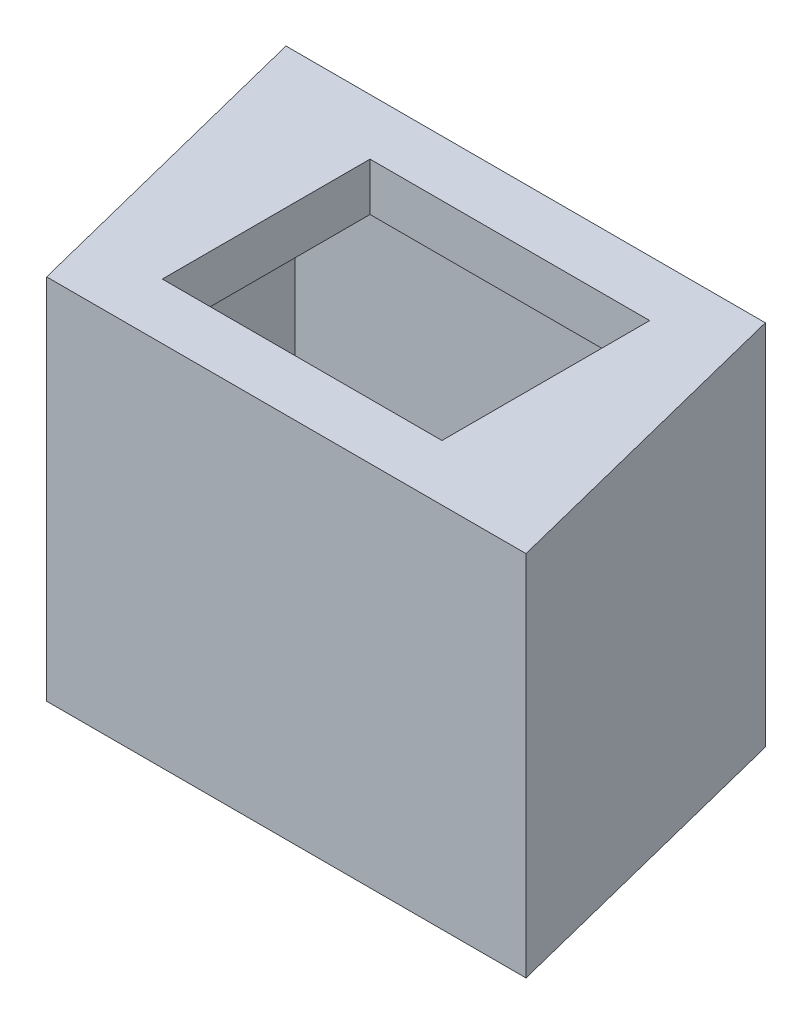
ISO-10303-21;
HEADER;
FILE_DESCRIPTION(('STEP AP214'),'2;1');
FILE_NAME('part.step','',(''),(''),'','','');
FILE_SCHEMA(('AUTOMOTIVE_DESIGN { 1 0 10303 214 1 1 1 1 }'));
ENDSEC;
DATA;
#1=APPLICATION_CONTEXT('core data for automotive mechanical design processes');
#2=APPLICATION_PROTOCOL_DEFINITION('international standard','automotive_design',2000,#1);
#3=PRODUCT_CONTEXT('',#1,'mechanical');
#4=PRODUCT('Part','Part','',(#3));
#5=PRODUCT_RELATED_PRODUCT_CATEGORY('part','',(#4));
#6=PRODUCT_DEFINITION_FORMATION('','',#4);
#7=PRODUCT_DEFINITION_CONTEXT('part definition',#1,'design');
#8=PRODUCT_DEFINITION('design','',#6,#7);
#9=PRODUCT_DEFINITION_SHAPE('','',#8);
#10=(LENGTH_UNIT() NAMED_UNIT(*) SI_UNIT(.MILLI.,.METRE.));
#11=(NAMED_UNIT(*) PLANE_ANGLE_UNIT() SI_UNIT($,.RADIAN.));
#12=(NAMED_UNIT(*) SI_UNIT($,.STERADIAN.) SOLID_ANGLE_UNIT());
#13=UNCERTAINTY_MEASURE_WITH_UNIT(LENGTH_MEASURE(1.E-05),#10,'distance_accuracy_value','');
#14=(GEOMETRIC_REPRESENTATION_CONTEXT(3) GLOBAL_UNCERTAINTY_ASSIGNED_CONTEXT((#13)) GLOBAL_UNIT_ASSIGNED_CONTEXT((#10,
#11,#12)) REPRESENTATION_CONTEXT('',''));
#15=CARTESIAN_POINT('',(0.,0.,0.));
#16=DIRECTION('',(0.,0.,1.));
#17=DIRECTION('',(1.,0.,0.));
#18=AXIS2_PLACEMENT_3D('',#15,#16,#17);
#19=CARTESIAN_POINT('',(5.02365276957694,3.,20.));
#20=DIRECTION('',(0.969872015284747,0.,-0.243615011786019));
#21=DIRECTION('',(-0.24361501178602,0.,-0.969872015284748));
#22=AXIS2_PLACEMENT_3D('',#19,#20,#21);
#23=PLANE('',#22);
#24=DIRECTION('',(0.,-1.,0.));
#25=VECTOR('',#24,1.);
#26=CARTESIAN_POINT('',(0.,3.,0.));
#27=LINE('',#26,#25);
#28=CARTESIAN_POINT('',(0.,3.,0.));
#29=VERTEX_POINT('',#28);
#30=CARTESIAN_POINT('',(0.,-20.,0.));
#31=VERTEX_POINT('',#30);
#32=EDGE_CURVE('E210',#29,#31,#27,.T.);
#33=ORIENTED_EDGE('',*,*,#32,.T.);
#34=DIRECTION('',(-0.243615011786019,0.,-0.969872015284748));
#35=VECTOR('',#34,1.);
#36=CARTESIAN_POINT('',(5.02365276957694,-20.,20.));
#37=LINE('',#36,#35);
#38=CARTESIAN_POINT('',(5.02365276957694,-20.,20.));
#39=VERTEX_POINT('',#38);
#40=EDGE_CURVE('E160',#39,#31,#37,.T.);
#41=ORIENTED_EDGE('',*,*,#40,.F.);
#42=DIRECTION('',(0.,-1.,0.));
#43=VECTOR('',#42,1.);
#44=CARTESIAN_POINT('',(5.02365276957694,3.,20.));
#45=LINE('',#44,#43);
#46=CARTESIAN_POINT('',(5.02365276957694,3.,20.));
#47=VERTEX_POINT('',#46);
#48=EDGE_CURVE('E11',#47,#39,#45,.T.);
#49=ORIENTED_EDGE('',*,*,#48,.F.);
#50=DIRECTION('',(0.243615011786019,0.,0.969872015284748));
#51=VECTOR('',#50,1.);
#52=CARTESIAN_POINT('',(5.02365276957694,3.,20.));
#53=LINE('',#52,#51);
#54=EDGE_CURVE('E195',#29,#47,#53,.T.);
#55=ORIENTED_EDGE('',*,*,#54,.F.);
#56=EDGE_LOOP('',(#33,#41,#49,#55));
#57=FACE_BOUND('',#56,.T.);
#58=ADVANCED_FACE('F35',(#57),#23,.F.);
#59=CARTESIAN_POINT('',(35.0236527695769,3.,20.));
#60=DIRECTION('',(0.,0.,-1.));
#61=DIRECTION('',(-1.,0.,0.));
#62=AXIS2_PLACEMENT_3D('',#59,#60,#61);
#63=PLANE('',#62);
#64=ORIENTED_EDGE('',*,*,#48,.T.);
#65=DIRECTION('',(-1.,0.,0.));
#66=VECTOR('',#65,1.);
#67=CARTESIAN_POINT('',(35.0236527695769,-20.,20.));
#68=LINE('',#67,#66);
#69=CARTESIAN_POINT('',(35.0236527695769,-20.,20.));
#70=VERTEX_POINT('',#69);
#71=EDGE_CURVE('E136',#70,#39,#68,.T.);
#72=ORIENTED_EDGE('',*,*,#71,.F.);
#73=DIRECTION('',(0.,-1.,0.));
#74=VECTOR('',#73,1.);
#75=CARTESIAN_POINT('',(35.0236527695769,3.,20.));
#76=LINE('',#75,#74);
#77=CARTESIAN_POINT('',(35.0236527695769,3.,20.));
#78=VERTEX_POINT('',#77);
#79=EDGE_CURVE('E42',#78,#70,#76,.T.);
#80=ORIENTED_EDGE('',*,*,#79,.F.);
#81=DIRECTION('',(1.,0.,0.));
#82=VECTOR('',#81,1.);
#83=CARTESIAN_POINT('',(35.0236527695769,3.,20.));
#84=LINE('',#83,#82);
#85=EDGE_CURVE('E204',#47,#78,#84,.T.);
#86=ORIENTED_EDGE('',*,*,#85,.F.);
#87=EDGE_LOOP('',(#64,#72,#80,#86));
#88=FACE_BOUND('',#87,.T.);
#89=ADVANCED_FACE('F223',(#88),#63,.F.);
#90=CARTESIAN_POINT('',(30.,3.,0.));
#91=DIRECTION('',(-0.969872015284747,0.,0.24361501178602));
#92=DIRECTION('',(0.24361501178602,0.,0.969872015284748));
#93=AXIS2_PLACEMENT_3D('',#90,#91,#92);
#94=PLANE('',#93);
#95=ORIENTED_EDGE('',*,*,#79,.T.);
#96=DIRECTION('',(0.24361501178602,0.,0.969872015284748));
#97=VECTOR('',#96,1.);
#98=CARTESIAN_POINT('',(30.,-20.,0.));
#99=LINE('',#98,#97);
#100=CARTESIAN_POINT('',(30.,-20.,0.));
#101=VERTEX_POINT('',#100);
#102=EDGE_CURVE('E166',#101,#70,#99,.T.);
#103=ORIENTED_EDGE('',*,*,#102,.F.);
#104=DIRECTION('',(0.,-1.,0.));
#105=VECTOR('',#104,1.);
#106=CARTESIAN_POINT('',(30.,3.,0.));
#107=LINE('',#106,#105);
#108=CARTESIAN_POINT('',(30.,3.,0.));
#109=VERTEX_POINT('',#108);
#110=EDGE_CURVE('E212',#109,#101,#107,.T.);
#111=ORIENTED_EDGE('',*,*,#110,.F.);
#112=DIRECTION('',(-0.24361501178602,0.,-0.969872015284748));
#113=VECTOR('',#112,1.);
#114=CARTESIAN_POINT('',(30.,3.,0.));
#115=LINE('',#114,#113);
#116=EDGE_CURVE('E206',#78,#109,#115,.T.);
#117=ORIENTED_EDGE('',*,*,#116,.F.);
#118=EDGE_LOOP('',(#95,#103,#111,#117));
#119=FACE_BOUND('',#118,.T.);
#120=ADVANCED_FACE('F217',(#119),#94,.F.);
#121=CARTESIAN_POINT('',(0.,3.,0.));
#122=DIRECTION('',(0.,0.,1.));
#123=DIRECTION('',(1.,0.,0.));
#124=AXIS2_PLACEMENT_3D('',#121,#122,#123);
#125=PLANE('',#124);
#126=ORIENTED_EDGE('',*,*,#110,.T.);
#127=DIRECTION('',(1.,0.,0.));
#128=VECTOR('',#127,1.);
#129=CARTESIAN_POINT('',(0.,-20.,0.));
#130=LINE('',#129,#128);
#131=EDGE_CURVE('E163',#31,#101,#130,.T.);
#132=ORIENTED_EDGE('',*,*,#131,.F.);
#133=ORIENTED_EDGE('',*,*,#32,.F.);
#134=DIRECTION('',(-1.,0.,0.));
#135=VECTOR('',#134,1.);
#136=CARTESIAN_POINT('',(0.,3.,0.));
#137=LINE('',#136,#135);
#138=EDGE_CURVE('E208',#109,#29,#137,.T.);
#139=ORIENTED_EDGE('',*,*,#138,.F.);
#140=EDGE_LOOP('',(#126,#132,#133,#139));
#141=FACE_BOUND('',#140,.T.);
#142=ADVANCED_FACE('F230',(#141),#125,.F.);
#143=CARTESIAN_POINT('',(0.,3.,0.));
#144=DIRECTION('',(0.,-1.,0.));
#145=DIRECTION('',(0.,0.,-1.));
#146=AXIS2_PLACEMENT_3D('',#143,#144,#145);
#147=PLANE('',#146);
#148=DIRECTION('',(1.,0.,0.));
#149=VECTOR('',#148,1.);
#150=CARTESIAN_POINT('',(8.76182638478847,3.,16.5));
#151=LINE('',#150,#149);
#152=CARTESIAN_POINT('',(8.76182638478847,3.,16.5));
#153=VERTEX_POINT('',#152);
#154=CARTESIAN_POINT('',(26.2618263847885,3.,16.5));
#155=VERTEX_POINT('',#154);
#156=EDGE_CURVE('E185',#153,#155,#151,.T.);
#157=ORIENTED_EDGE('',*,*,#156,.F.);
#158=DIRECTION('',(0.,0.,1.));
#159=VECTOR('',#158,1.);
#160=CARTESIAN_POINT('',(8.76182638478847,3.,3.5));
#161=LINE('',#160,#159);
#162=CARTESIAN_POINT('',(8.76182638478847,3.,3.5));
#163=VERTEX_POINT('',#162);
#164=EDGE_CURVE('E169',#163,#153,#161,.T.);
#165=ORIENTED_EDGE('',*,*,#164,.F.);
#166=DIRECTION('',(-1.,0.,0.));
#167=VECTOR('',#166,1.);
#168=CARTESIAN_POINT('',(8.76182638478847,3.,3.5));
#169=LINE('',#168,#167);
#170=CARTESIAN_POINT('',(26.2618263847885,3.,3.5));
#171=VERTEX_POINT('',#170);
#172=EDGE_CURVE('E174',#171,#163,#169,.T.);
#173=ORIENTED_EDGE('',*,*,#172,.F.);
#174=DIRECTION('',(0.,0.,-1.));
#175=VECTOR('',#174,1.);
#176=CARTESIAN_POINT('',(26.2618263847885,3.,3.5));
#177=LINE('',#176,#175);
#178=EDGE_CURVE('E188',#155,#171,#177,.T.);
#179=ORIENTED_EDGE('',*,*,#178,.F.);
#180=EDGE_LOOP('',(#157,#165,#173,#179));
#181=FACE_BOUND('',#180,.T.);
#182=ORIENTED_EDGE('',*,*,#54,.T.);
#183=ORIENTED_EDGE('',*,*,#85,.T.);
#184=ORIENTED_EDGE('',*,*,#116,.T.);
#185=ORIENTED_EDGE('',*,*,#138,.T.);
#186=EDGE_LOOP('',(#182,#183,#184,#185));
#187=FACE_BOUND('',#186,.T.);
#188=ADVANCED_FACE('F233',(#181,#187),#147,.F.);
#189=CARTESIAN_POINT('',(0.,0.,0.));
#190=DIRECTION('',(0.,-1.,0.));
#191=DIRECTION('',(0.,0.,-1.));
#192=AXIS2_PLACEMENT_3D('',#189,#190,#191);
#193=PLANE('',#192);
#194=DIRECTION('',(-1.,0.,0.));
#195=VECTOR('',#194,1.);
#196=CARTESIAN_POINT('',(32.4591597391828,0.,18.));
#197=LINE('',#196,#195);
#198=CARTESIAN_POINT('',(32.4591597391828,0.,18.));
#199=VERTEX_POINT('',#198);
#200=CARTESIAN_POINT('',(6.58341524605567,0.,18.));
#201=VERTEX_POINT('',#200);
#202=EDGE_CURVE('E49',#199,#201,#197,.T.);
#203=ORIENTED_EDGE('',*,*,#202,.T.);
#204=DIRECTION('',(-0.243615011786019,0.,-0.969872015284748));
#205=VECTOR('',#204,1.);
#206=CARTESIAN_POINT('',(6.58341524605567,0.,18.));
#207=LINE('',#206,#205);
#208=CARTESIAN_POINT('',(2.56449303039413,0.,2.));
#209=VERTEX_POINT('',#208);
#210=EDGE_CURVE('E53',#201,#209,#207,.T.);
#211=ORIENTED_EDGE('',*,*,#210,.T.);
#212=DIRECTION('',(1.,0.,0.));
#213=VECTOR('',#212,1.);
#214=CARTESIAN_POINT('',(2.56449303039413,0.,2.));
#215=LINE('',#214,#213);
#216=CARTESIAN_POINT('',(28.4402375235213,0.,2.));
#217=VERTEX_POINT('',#216);
#218=EDGE_CURVE('E150',#209,#217,#215,.T.);
#219=ORIENTED_EDGE('',*,*,#218,.T.);
#220=DIRECTION('',(0.243615011786019,0.,0.969872015284748));
#221=VECTOR('',#220,1.);
#222=CARTESIAN_POINT('',(28.4402375235213,0.,2.));
#223=LINE('',#222,#221);
#224=EDGE_CURVE('E131',#217,#199,#223,.T.);
#225=ORIENTED_EDGE('',*,*,#224,.T.);
#226=EDGE_LOOP('',(#203,#211,#219,#225));
#227=FACE_BOUND('',#226,.T.);
#228=DIRECTION('',(0.,0.,1.));
#229=VECTOR('',#228,1.);
#230=CARTESIAN_POINT('',(8.76182638478847,0.,3.5));
#231=LINE('',#230,#229);
#232=CARTESIAN_POINT('',(8.76182638478847,0.,3.5));
#233=VERTEX_POINT('',#232);
#234=CARTESIAN_POINT('',(8.76182638478847,0.,16.5));
#235=VERTEX_POINT('',#234);
#236=EDGE_CURVE('E170',#233,#235,#231,.T.);
#237=ORIENTED_EDGE('',*,*,#236,.T.);
#238=DIRECTION('',(1.,0.,0.));
#239=VECTOR('',#238,1.);
#240=CARTESIAN_POINT('',(8.76182638478847,0.,16.5));
#241=LINE('',#240,#239);
#242=CARTESIAN_POINT('',(26.2618263847885,0.,16.5));
#243=VERTEX_POINT('',#242);
#244=EDGE_CURVE('E173',#235,#243,#241,.T.);
#245=ORIENTED_EDGE('',*,*,#244,.T.);
#246=DIRECTION('',(0.,0.,-1.));
#247=VECTOR('',#246,1.);
#248=CARTESIAN_POINT('',(26.2618263847885,0.,3.5));
#249=LINE('',#248,#247);
#250=CARTESIAN_POINT('',(26.2618263847885,0.,3.5));
#251=VERTEX_POINT('',#250);
#252=EDGE_CURVE('E177',#243,#251,#249,.T.);
#253=ORIENTED_EDGE('',*,*,#252,.T.);
#254=DIRECTION('',(-1.,0.,0.));
#255=VECTOR('',#254,1.);
#256=CARTESIAN_POINT('',(8.76182638478847,0.,3.5));
#257=LINE('',#256,#255);
#258=EDGE_CURVE('E180',#251,#233,#257,.T.);
#259=ORIENTED_EDGE('',*,*,#258,.T.);
#260=EDGE_LOOP('',(#237,#245,#253,#259));
#261=FACE_BOUND('',#260,.T.);
#262=ADVANCED_FACE('F235',(#227,#261),#193,.T.);
#263=CARTESIAN_POINT('',(8.76182638478847,0.,3.5));
#264=DIRECTION('',(-1.,0.,0.));
#265=DIRECTION('',(0.,0.,1.));
#266=AXIS2_PLACEMENT_3D('',#263,#264,#265);
#267=PLANE('',#266);
#268=ORIENTED_EDGE('',*,*,#164,.T.);
#269=DIRECTION('',(0.,1.,0.));
#270=VECTOR('',#269,1.);
#271=CARTESIAN_POINT('',(8.76182638478847,0.,16.5));
#272=LINE('',#271,#270);
#273=EDGE_CURVE('E183',#235,#153,#272,.T.);
#274=ORIENTED_EDGE('',*,*,#273,.F.);
#275=ORIENTED_EDGE('',*,*,#236,.F.);
#276=DIRECTION('',(0.,1.,0.));
#277=VECTOR('',#276,1.);
#278=CARTESIAN_POINT('',(8.76182638478847,0.,3.5));
#279=LINE('',#278,#277);
#280=EDGE_CURVE('E193',#233,#163,#279,.T.);
#281=ORIENTED_EDGE('',*,*,#280,.T.);
#282=EDGE_LOOP('',(#268,#274,#275,#281));
#283=FACE_BOUND('',#282,.T.);
#284=ADVANCED_FACE('F242',(#283),#267,.F.);
#285=CARTESIAN_POINT('',(8.76182638478847,0.,3.5));
#286=DIRECTION('',(0.,0.,-1.));
#287=DIRECTION('',(-1.,0.,0.));
#288=AXIS2_PLACEMENT_3D('',#285,#286,#287);
#289=PLANE('',#288);
#290=ORIENTED_EDGE('',*,*,#172,.T.);
#291=ORIENTED_EDGE('',*,*,#280,.F.);
#292=ORIENTED_EDGE('',*,*,#258,.F.);
#293=DIRECTION('',(0.,1.,0.));
#294=VECTOR('',#293,1.);
#295=CARTESIAN_POINT('',(26.2618263847885,0.,3.5));
#296=LINE('',#295,#294);
#297=EDGE_CURVE('E196',#251,#171,#296,.T.);
#298=ORIENTED_EDGE('',*,*,#297,.T.);
#299=EDGE_LOOP('',(#290,#291,#292,#298));
#300=FACE_BOUND('',#299,.T.);
#301=ADVANCED_FACE('F323',(#300),#289,.F.);
#302=CARTESIAN_POINT('',(26.2618263847885,0.,3.5));
#303=DIRECTION('',(1.,0.,0.));
#304=DIRECTION('',(0.,0.,-1.));
#305=AXIS2_PLACEMENT_3D('',#302,#303,#304);
#306=PLANE('',#305);
#307=ORIENTED_EDGE('',*,*,#178,.T.);
#308=ORIENTED_EDGE('',*,*,#297,.F.);
#309=ORIENTED_EDGE('',*,*,#252,.F.);
#310=DIRECTION('',(0.,1.,0.));
#311=VECTOR('',#310,1.);
#312=CARTESIAN_POINT('',(26.2618263847885,0.,16.5));
#313=LINE('',#312,#311);
#314=EDGE_CURVE('E198',#243,#155,#313,.T.);
#315=ORIENTED_EDGE('',*,*,#314,.T.);
#316=EDGE_LOOP('',(#307,#308,#309,#315));
#317=FACE_BOUND('',#316,.T.);
#318=ADVANCED_FACE('F326',(#317),#306,.F.);
#319=CARTESIAN_POINT('',(8.76182638478847,0.,16.5));
#320=DIRECTION('',(0.,0.,1.));
#321=DIRECTION('',(1.,0.,0.));
#322=AXIS2_PLACEMENT_3D('',#319,#320,#321);
#323=PLANE('',#322);
#324=ORIENTED_EDGE('',*,*,#156,.T.);
#325=ORIENTED_EDGE('',*,*,#314,.F.);
#326=ORIENTED_EDGE('',*,*,#244,.F.);
#327=ORIENTED_EDGE('',*,*,#273,.T.);
#328=EDGE_LOOP('',(#324,#325,#326,#327));
#329=FACE_BOUND('',#328,.T.);
#330=ADVANCED_FACE('F280',(#329),#323,.F.);
#331=CARTESIAN_POINT('',(0.,-20.,0.));
#332=DIRECTION('',(0.,-1.,0.));
#333=DIRECTION('',(0.,0.,-1.));
#334=AXIS2_PLACEMENT_3D('',#331,#332,#333);
#335=PLANE('',#334);
#336=ORIENTED_EDGE('',*,*,#71,.T.);
#337=ORIENTED_EDGE('',*,*,#40,.T.);
#338=ORIENTED_EDGE('',*,*,#131,.T.);
#339=ORIENTED_EDGE('',*,*,#102,.T.);
#340=EDGE_LOOP('',(#336,#337,#338,#339));
#341=FACE_BOUND('',#340,.T.);
#342=DIRECTION('',(-0.243615011786019,0.,-0.969872015284748));
#343=VECTOR('',#342,1.);
#344=CARTESIAN_POINT('',(6.58341524605567,-20.,18.));
#345=LINE('',#344,#343);
#346=CARTESIAN_POINT('',(6.58341524605567,-20.,18.));
#347=VERTEX_POINT('',#346);
#348=CARTESIAN_POINT('',(2.56449303039413,-20.,2.));
#349=VERTEX_POINT('',#348);
#350=EDGE_CURVE('E130',#347,#349,#345,.T.);
#351=ORIENTED_EDGE('',*,*,#350,.F.);
#352=DIRECTION('',(-1.,0.,0.));
#353=VECTOR('',#352,1.);
#354=CARTESIAN_POINT('',(32.4591597391828,-20.,18.));
#355=LINE('',#354,#353);
#356=CARTESIAN_POINT('',(32.4591597391828,-20.,18.));
#357=VERTEX_POINT('',#356);
#358=EDGE_CURVE('E121',#357,#347,#355,.T.);
#359=ORIENTED_EDGE('',*,*,#358,.F.);
#360=DIRECTION('',(0.243615011786019,0.,0.969872015284748));
#361=VECTOR('',#360,1.);
#362=CARTESIAN_POINT('',(28.4402375235213,-20.,2.));
#363=LINE('',#362,#361);
#364=CARTESIAN_POINT('',(28.4402375235213,-20.,2.));
#365=VERTEX_POINT('',#364);
#366=EDGE_CURVE('E144',#365,#357,#363,.T.);
#367=ORIENTED_EDGE('',*,*,#366,.F.);
#368=DIRECTION('',(1.,0.,0.));
#369=VECTOR('',#368,1.);
#370=CARTESIAN_POINT('',(2.56449303039413,-20.,2.));
#371=LINE('',#370,#369);
#372=EDGE_CURVE('E142',#349,#365,#371,.T.);
#373=ORIENTED_EDGE('',*,*,#372,.F.);
#374=EDGE_LOOP('',(#351,#359,#367,#373));
#375=FACE_BOUND('',#374,.T.);
#376=ADVANCED_FACE('F140',(#341,#375),#335,.T.);
#377=CARTESIAN_POINT('',(32.4591597391828,-20.,18.));
#378=DIRECTION('',(0.,0.,-1.));
#379=DIRECTION('',(-1.,0.,0.));
#380=AXIS2_PLACEMENT_3D('',#377,#378,#379);
#381=PLANE('',#380);
#382=ORIENTED_EDGE('',*,*,#202,.F.);
#383=DIRECTION('',(0.,1.,0.));
#384=VECTOR('',#383,1.);
#385=CARTESIAN_POINT('',(32.4591597391828,-20.,18.));
#386=LINE('',#385,#384);
#387=EDGE_CURVE('E126',#357,#199,#386,.T.);
#388=ORIENTED_EDGE('',*,*,#387,.F.);
#389=ORIENTED_EDGE('',*,*,#358,.T.);
#390=DIRECTION('',(0.,1.,0.));
#391=VECTOR('',#390,1.);
#392=CARTESIAN_POINT('',(6.58341524605567,-20.,18.));
#393=LINE('',#392,#391);
#394=EDGE_CURVE('E124',#347,#201,#393,.T.);
#395=ORIENTED_EDGE('',*,*,#394,.T.);
#396=EDGE_LOOP('',(#382,#388,#389,#395));
#397=FACE_BOUND('',#396,.T.);
#398=ADVANCED_FACE('F123',(#397),#381,.T.);
#399=CARTESIAN_POINT('',(6.58341524605567,-20.,18.));
#400=DIRECTION('',(0.969872015284748,0.,-0.243615011786019));
#401=DIRECTION('',(-0.243615011786019,0.,-0.969872015284748));
#402=AXIS2_PLACEMENT_3D('',#399,#400,#401);
#403=PLANE('',#402);
#404=ORIENTED_EDGE('',*,*,#210,.F.);
#405=ORIENTED_EDGE('',*,*,#394,.F.);
#406=ORIENTED_EDGE('',*,*,#350,.T.);
#407=DIRECTION('',(0.,1.,0.));
#408=VECTOR('',#407,1.);
#409=CARTESIAN_POINT('',(2.56449303039413,-20.,2.));
#410=LINE('',#409,#408);
#411=EDGE_CURVE('E137',#349,#209,#410,.T.);
#412=ORIENTED_EDGE('',*,*,#411,.T.);
#413=EDGE_LOOP('',(#404,#405,#406,#412));
#414=FACE_BOUND('',#413,.T.);
#415=ADVANCED_FACE('F134',(#414),#403,.T.);
#416=CARTESIAN_POINT('',(2.56449303039413,-20.,2.));
#417=DIRECTION('',(0.,0.,1.));
#418=DIRECTION('',(1.,0.,0.));
#419=AXIS2_PLACEMENT_3D('',#416,#417,#418);
#420=PLANE('',#419);
#421=ORIENTED_EDGE('',*,*,#218,.F.);
#422=ORIENTED_EDGE('',*,*,#411,.F.);
#423=ORIENTED_EDGE('',*,*,#372,.T.);
#424=DIRECTION('',(0.,1.,0.));
#425=VECTOR('',#424,1.);
#426=CARTESIAN_POINT('',(28.4402375235213,-20.,2.));
#427=LINE('',#426,#425);
#428=EDGE_CURVE('E154',#365,#217,#427,.T.);
#429=ORIENTED_EDGE('',*,*,#428,.T.);
#430=EDGE_LOOP('',(#421,#422,#423,#429));
#431=FACE_BOUND('',#430,.T.);
#432=ADVANCED_FACE('F298',(#431),#420,.T.);
#433=CARTESIAN_POINT('',(28.4402375235213,-20.,2.));
#434=DIRECTION('',(-0.969872015284748,0.,0.243615011786019));
#435=DIRECTION('',(0.243615011786019,0.,0.969872015284748));
#436=AXIS2_PLACEMENT_3D('',#433,#434,#435);
#437=PLANE('',#436);
#438=ORIENTED_EDGE('',*,*,#224,.F.);
#439=ORIENTED_EDGE('',*,*,#428,.F.);
#440=ORIENTED_EDGE('',*,*,#366,.T.);
#441=ORIENTED_EDGE('',*,*,#387,.T.);
#442=EDGE_LOOP('',(#438,#439,#440,#441));
#443=FACE_BOUND('',#442,.T.);
#444=ADVANCED_FACE('F307',(#443),#437,.T.);
#445=CLOSED_SHELL('',(#58,#89,#120,#142,#188,#262,#284,#301,#318,#330,#376,#398,#415,#432,#444));
#446=MANIFOLD_SOLID_BREP('B2',#445);
#447=ADVANCED_BREP_SHAPE_REPRESENTATION('',(#18,#446),#14);
#448=SHAPE_DEFINITION_REPRESENTATION(#9,#447);
ENDSEC;
END-ISO-10303-21;
